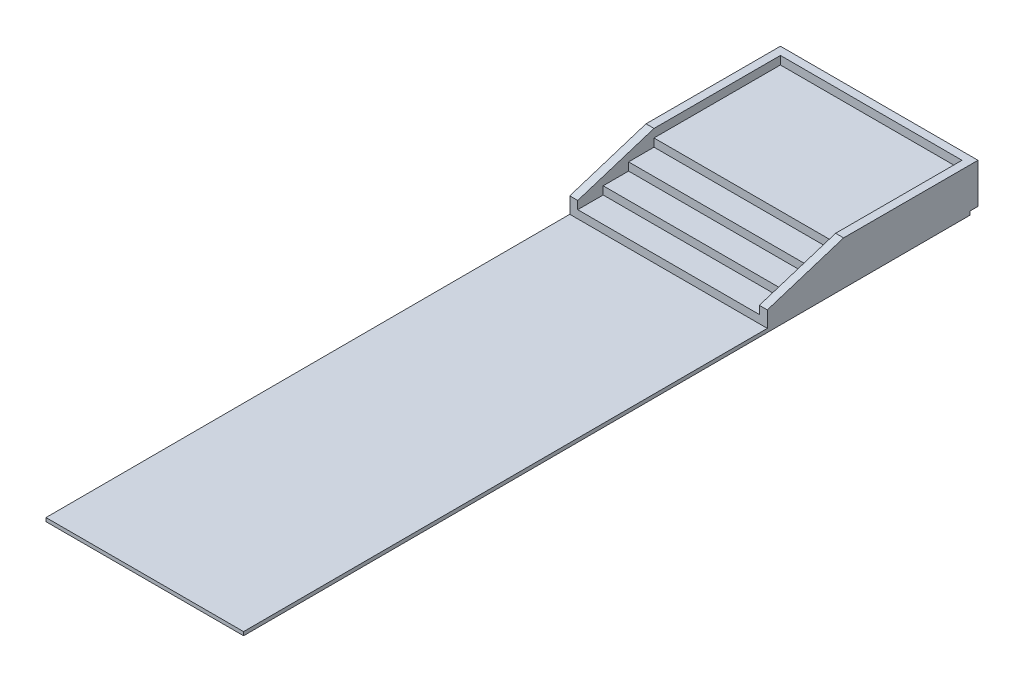
ISO-10303-21;
HEADER;
FILE_DESCRIPTION(('STEP AP214'),'2;1');
FILE_NAME('part.step','',(''),(''),'','','');
FILE_SCHEMA(('AUTOMOTIVE_DESIGN { 1 0 10303 214 1 1 1 1 }'));
ENDSEC;
DATA;
#1=APPLICATION_CONTEXT('core data for automotive mechanical design processes');
#2=APPLICATION_PROTOCOL_DEFINITION('international standard','automotive_design',2000,#1);
#3=PRODUCT_CONTEXT('',#1,'mechanical');
#4=PRODUCT('Part','Part','',(#3));
#5=PRODUCT_RELATED_PRODUCT_CATEGORY('part','',(#4));
#6=PRODUCT_DEFINITION_FORMATION('','',#4);
#7=PRODUCT_DEFINITION_CONTEXT('part definition',#1,'design');
#8=PRODUCT_DEFINITION('design','',#6,#7);
#9=PRODUCT_DEFINITION_SHAPE('','',#8);
#10=(LENGTH_UNIT() NAMED_UNIT(*) SI_UNIT(.MILLI.,.METRE.));
#11=(NAMED_UNIT(*) PLANE_ANGLE_UNIT() SI_UNIT($,.RADIAN.));
#12=(NAMED_UNIT(*) SI_UNIT($,.STERADIAN.) SOLID_ANGLE_UNIT());
#13=UNCERTAINTY_MEASURE_WITH_UNIT(LENGTH_MEASURE(1.E-05),#10,'distance_accuracy_value','');
#14=(GEOMETRIC_REPRESENTATION_CONTEXT(3) GLOBAL_UNCERTAINTY_ASSIGNED_CONTEXT((#13)) GLOBAL_UNIT_ASSIGNED_CONTEXT((#10,
#11,#12)) REPRESENTATION_CONTEXT('',''));
#15=CARTESIAN_POINT('',(0.,0.,0.));
#16=DIRECTION('',(0.,0.,1.));
#17=DIRECTION('',(1.,0.,0.));
#18=AXIS2_PLACEMENT_3D('',#15,#16,#17);
#19=CARTESIAN_POINT('',(500.,0.,0.));
#20=DIRECTION('',(1.,0.,0.));
#21=DIRECTION('',(0.,0.,-1.));
#22=AXIS2_PLACEMENT_3D('',#19,#20,#21);
#23=PLANE('',#22);
#24=DIRECTION('',(0.,-1.,0.));
#25=VECTOR('',#24,1.);
#26=CARTESIAN_POINT('',(500.,110.,-349.256226637812));
#27=LINE('',#26,#25);
#28=CARTESIAN_POINT('',(500.,110.,-349.256226637812));
#29=VERTEX_POINT('',#28);
#30=CARTESIAN_POINT('',(500.,87.2165650206571,-349.256226637812));
#31=VERTEX_POINT('',#30);
#32=EDGE_CURVE('E314',#29,#31,#27,.T.);
#33=ORIENTED_EDGE('',*,*,#32,.T.);
#34=DIRECTION('',(0.,0.,1.));
#35=VECTOR('',#34,1.);
#36=CARTESIAN_POINT('',(500.,87.2165650206571,-1.25622663781233));
#37=LINE('',#36,#35);
#38=CARTESIAN_POINT('',(500.,87.2165650206571,-1.25622663781233));
#39=VERTEX_POINT('',#38);
#40=EDGE_CURVE('E199',#31,#39,#37,.T.);
#41=ORIENTED_EDGE('',*,*,#40,.T.);
#42=DIRECTION('',(0.,-1.,0.));
#43=VECTOR('',#42,1.);
#44=CARTESIAN_POINT('',(500.,87.2165650206571,-1.25622663781233));
#45=LINE('',#44,#43);
#46=CARTESIAN_POINT('',(500.,65.2165650206571,-1.25622663781233));
#47=VERTEX_POINT('',#46);
#48=EDGE_CURVE('E139',#39,#47,#45,.T.);
#49=ORIENTED_EDGE('',*,*,#48,.T.);
#50=DIRECTION('',(0.,0.,1.));
#51=VECTOR('',#50,1.);
#52=CARTESIAN_POINT('',(500.,65.2165650206571,-1.25622663781233));
#53=LINE('',#52,#51);
#54=CARTESIAN_POINT('',(500.,65.2165650206571,68.7437733621877));
#55=VERTEX_POINT('',#54);
#56=EDGE_CURVE('E137',#47,#55,#53,.T.);
#57=ORIENTED_EDGE('',*,*,#56,.T.);
#58=DIRECTION('',(0.,-1.,0.));
#59=VECTOR('',#58,1.);
#60=CARTESIAN_POINT('',(500.,65.2165650206571,68.7437733621877));
#61=LINE('',#60,#59);
#62=CARTESIAN_POINT('',(500.,43.2165650206571,68.7437733621877));
#63=VERTEX_POINT('',#62);
#64=EDGE_CURVE('E118',#55,#63,#61,.T.);
#65=ORIENTED_EDGE('',*,*,#64,.T.);
#66=DIRECTION('',(0.,0.,1.));
#67=VECTOR('',#66,1.);
#68=CARTESIAN_POINT('',(500.,43.2165650206571,68.7437733621877));
#69=LINE('',#68,#67);
#70=CARTESIAN_POINT('',(500.,43.2165650206571,138.743773362188));
#71=VERTEX_POINT('',#70);
#72=EDGE_CURVE('E129',#63,#71,#69,.T.);
#73=ORIENTED_EDGE('',*,*,#72,.T.);
#74=DIRECTION('',(0.,-1.,0.));
#75=VECTOR('',#74,1.);
#76=CARTESIAN_POINT('',(500.,43.2165650206571,138.743773362188));
#77=LINE('',#76,#75);
#78=CARTESIAN_POINT('',(500.,21.2165650206571,138.743773362188));
#79=VERTEX_POINT('',#78);
#80=EDGE_CURVE('E133',#71,#79,#77,.T.);
#81=ORIENTED_EDGE('',*,*,#80,.T.);
#82=DIRECTION('',(0.,0.,1.));
#83=VECTOR('',#82,1.);
#84=CARTESIAN_POINT('',(500.,21.2165650206571,138.743773362188));
#85=LINE('',#84,#83);
#86=CARTESIAN_POINT('',(500.,21.2165650206571,208.743773362188));
#87=VERTEX_POINT('',#86);
#88=EDGE_CURVE('E144',#79,#87,#85,.T.);
#89=ORIENTED_EDGE('',*,*,#88,.T.);
#90=DIRECTION('',(0.,-1.,0.));
#91=VECTOR('',#90,1.);
#92=CARTESIAN_POINT('',(500.,-0.783434979342946,208.743773362188));
#93=LINE('',#92,#91);
#94=CARTESIAN_POINT('',(500.,43.2165650206571,208.743773362188));
#95=VERTEX_POINT('',#94);
#96=EDGE_CURVE('E193',#95,#87,#93,.T.);
#97=ORIENTED_EDGE('',*,*,#96,.F.);
#98=DIRECTION('',(0.,-0.303060470018651,0.952971327749201));
#99=VECTOR('',#98,1.);
#100=CARTESIAN_POINT('',(500.,110.,-1.25622663781244));
#101=LINE('',#100,#99);
#102=CARTESIAN_POINT('',(500.,110.,-1.25622663781244));
#103=VERTEX_POINT('',#102);
#104=EDGE_CURVE('E198',#103,#95,#101,.T.);
#105=ORIENTED_EDGE('',*,*,#104,.F.);
#106=DIRECTION('',(0.,0.,1.));
#107=VECTOR('',#106,1.);
#108=CARTESIAN_POINT('',(500.,110.,-371.256226637812));
#109=LINE('',#108,#107);
#110=EDGE_CURVE('E59',#29,#103,#109,.T.);
#111=ORIENTED_EDGE('',*,*,#110,.F.);
#112=EDGE_LOOP('',(#33,#41,#49,#57,#65,#73,#81,#89,#97,#105,#111));
#113=FACE_BOUND('',#112,.T.);
#114=ADVANCED_FACE('F41',(#113),#23,.F.);
#115=CARTESIAN_POINT('',(0.,0.,0.));
#116=DIRECTION('',(1.,0.,0.));
#117=DIRECTION('',(0.,0.,-1.));
#118=AXIS2_PLACEMENT_3D('',#115,#116,#117);
#119=PLANE('',#118);
#120=DIRECTION('',(0.,0.,1.));
#121=VECTOR('',#120,1.);
#122=CARTESIAN_POINT('',(0.,87.2165650206571,-1.25622663781233));
#123=LINE('',#122,#121);
#124=CARTESIAN_POINT('',(0.,87.2165650206571,-349.256226637812));
#125=VERTEX_POINT('',#124);
#126=CARTESIAN_POINT('',(0.,87.2165650206571,-1.25622663781233));
#127=VERTEX_POINT('',#126);
#128=EDGE_CURVE('E147',#125,#127,#123,.T.);
#129=ORIENTED_EDGE('',*,*,#128,.F.);
#130=DIRECTION('',(0.,-1.,0.));
#131=VECTOR('',#130,1.);
#132=CARTESIAN_POINT('',(0.,110.,-349.256226637812));
#133=LINE('',#132,#131);
#134=CARTESIAN_POINT('',(0.,110.,-349.256226637812));
#135=VERTEX_POINT('',#134);
#136=EDGE_CURVE('E306',#135,#125,#133,.T.);
#137=ORIENTED_EDGE('',*,*,#136,.F.);
#138=DIRECTION('',(0.,0.,1.));
#139=VECTOR('',#138,1.);
#140=CARTESIAN_POINT('',(0.,110.,-371.256226637812));
#141=LINE('',#140,#139);
#142=CARTESIAN_POINT('',(0.,110.,-1.25622663781244));
#143=VERTEX_POINT('',#142);
#144=EDGE_CURVE('E260',#135,#143,#141,.T.);
#145=ORIENTED_EDGE('',*,*,#144,.T.);
#146=DIRECTION('',(0.,-0.303060470018651,0.952971327749201));
#147=VECTOR('',#146,1.);
#148=CARTESIAN_POINT('',(0.,110.,-1.25622663781244));
#149=LINE('',#148,#147);
#150=CARTESIAN_POINT('',(0.,43.2165650206571,208.743773362188));
#151=VERTEX_POINT('',#150);
#152=EDGE_CURVE('E241',#143,#151,#149,.T.);
#153=ORIENTED_EDGE('',*,*,#152,.T.);
#154=DIRECTION('',(0.,-1.,0.));
#155=VECTOR('',#154,1.);
#156=CARTESIAN_POINT('',(0.,-0.783434979342946,208.743773362188));
#157=LINE('',#156,#155);
#158=CARTESIAN_POINT('',(0.,21.2165650206571,208.743773362188));
#159=VERTEX_POINT('',#158);
#160=EDGE_CURVE('E238',#151,#159,#157,.T.);
#161=ORIENTED_EDGE('',*,*,#160,.T.);
#162=DIRECTION('',(0.,0.,1.));
#163=VECTOR('',#162,1.);
#164=CARTESIAN_POINT('',(0.,21.2165650206571,138.743773362188));
#165=LINE('',#164,#163);
#166=CARTESIAN_POINT('',(0.,21.2165650206571,138.743773362188));
#167=VERTEX_POINT('',#166);
#168=EDGE_CURVE('E45',#167,#159,#165,.T.);
#169=ORIENTED_EDGE('',*,*,#168,.F.);
#170=DIRECTION('',(0.,-1.,0.));
#171=VECTOR('',#170,1.);
#172=CARTESIAN_POINT('',(0.,43.2165650206571,138.743773362188));
#173=LINE('',#172,#171);
#174=CARTESIAN_POINT('',(0.,43.2165650206571,138.743773362188));
#175=VERTEX_POINT('',#174);
#176=EDGE_CURVE('E168',#175,#167,#173,.T.);
#177=ORIENTED_EDGE('',*,*,#176,.F.);
#178=DIRECTION('',(0.,0.,1.));
#179=VECTOR('',#178,1.);
#180=CARTESIAN_POINT('',(0.,43.2165650206571,68.7437733621877));
#181=LINE('',#180,#179);
#182=CARTESIAN_POINT('',(0.,43.2165650206571,68.7437733621877));
#183=VERTEX_POINT('',#182);
#184=EDGE_CURVE('E170',#183,#175,#181,.T.);
#185=ORIENTED_EDGE('',*,*,#184,.F.);
#186=DIRECTION('',(0.,-1.,0.));
#187=VECTOR('',#186,1.);
#188=CARTESIAN_POINT('',(0.,65.2165650206571,68.7437733621877));
#189=LINE('',#188,#187);
#190=CARTESIAN_POINT('',(0.,65.2165650206571,68.7437733621877));
#191=VERTEX_POINT('',#190);
#192=EDGE_CURVE('E122',#191,#183,#189,.T.);
#193=ORIENTED_EDGE('',*,*,#192,.F.);
#194=DIRECTION('',(0.,0.,1.));
#195=VECTOR('',#194,1.);
#196=CARTESIAN_POINT('',(0.,65.2165650206571,-1.25622663781233));
#197=LINE('',#196,#195);
#198=CARTESIAN_POINT('',(0.,65.2165650206571,-1.25622663781233));
#199=VERTEX_POINT('',#198);
#200=EDGE_CURVE('E173',#199,#191,#197,.T.);
#201=ORIENTED_EDGE('',*,*,#200,.F.);
#202=DIRECTION('',(0.,-1.,0.));
#203=VECTOR('',#202,1.);
#204=CARTESIAN_POINT('',(0.,87.2165650206571,-1.25622663781233));
#205=LINE('',#204,#203);
#206=EDGE_CURVE('E82',#127,#199,#205,.T.);
#207=ORIENTED_EDGE('',*,*,#206,.F.);
#208=EDGE_LOOP('',(#129,#137,#145,#153,#161,#169,#177,#185,#193,#201,#207));
#209=FACE_BOUND('',#208,.T.);
#210=ADVANCED_FACE('F324',(#209),#119,.T.);
#211=CARTESIAN_POINT('',(500.,87.2165650206571,-1.25622663781233));
#212=DIRECTION('',(0.,-1.,0.));
#213=DIRECTION('',(0.,0.,-1.));
#214=AXIS2_PLACEMENT_3D('',#211,#212,#213);
#215=PLANE('',#214);
#216=ORIENTED_EDGE('',*,*,#128,.T.);
#217=DIRECTION('',(-1.,0.,0.));
#218=VECTOR('',#217,1.);
#219=CARTESIAN_POINT('',(500.,87.2165650206571,-1.25622663781233));
#220=LINE('',#219,#218);
#221=EDGE_CURVE('E51',#39,#127,#220,.T.);
#222=ORIENTED_EDGE('',*,*,#221,.F.);
#223=ORIENTED_EDGE('',*,*,#40,.F.);
#224=DIRECTION('',(-1.,0.,0.));
#225=VECTOR('',#224,1.);
#226=CARTESIAN_POINT('',(500.,87.2165650206571,-349.256226637812));
#227=LINE('',#226,#225);
#228=EDGE_CURVE('E11',#31,#125,#227,.T.);
#229=ORIENTED_EDGE('',*,*,#228,.T.);
#230=EDGE_LOOP('',(#216,#222,#223,#229));
#231=FACE_BOUND('',#230,.T.);
#232=ADVANCED_FACE('F43',(#231),#215,.F.);
#233=CARTESIAN_POINT('',(500.,87.2165650206571,-1.25622663781233));
#234=DIRECTION('',(0.,0.,-1.));
#235=DIRECTION('',(0.,1.,0.));
#236=AXIS2_PLACEMENT_3D('',#233,#234,#235);
#237=PLANE('',#236);
#238=ORIENTED_EDGE('',*,*,#206,.T.);
#239=DIRECTION('',(-1.,0.,0.));
#240=VECTOR('',#239,1.);
#241=CARTESIAN_POINT('',(500.,65.2165650206571,-1.25622663781233));
#242=LINE('',#241,#240);
#243=EDGE_CURVE('E157',#47,#199,#242,.T.);
#244=ORIENTED_EDGE('',*,*,#243,.F.);
#245=ORIENTED_EDGE('',*,*,#48,.F.);
#246=ORIENTED_EDGE('',*,*,#221,.T.);
#247=EDGE_LOOP('',(#238,#244,#245,#246));
#248=FACE_BOUND('',#247,.T.);
#249=ADVANCED_FACE('F477',(#248),#237,.F.);
#250=CARTESIAN_POINT('',(500.,65.2165650206571,-1.25622663781233));
#251=DIRECTION('',(0.,-1.,0.));
#252=DIRECTION('',(0.,0.,-1.));
#253=AXIS2_PLACEMENT_3D('',#250,#251,#252);
#254=PLANE('',#253);
#255=ORIENTED_EDGE('',*,*,#200,.T.);
#256=DIRECTION('',(-1.,0.,0.));
#257=VECTOR('',#256,1.);
#258=CARTESIAN_POINT('',(500.,65.2165650206571,68.7437733621877));
#259=LINE('',#258,#257);
#260=EDGE_CURVE('E125',#55,#191,#259,.T.);
#261=ORIENTED_EDGE('',*,*,#260,.F.);
#262=ORIENTED_EDGE('',*,*,#56,.F.);
#263=ORIENTED_EDGE('',*,*,#243,.T.);
#264=EDGE_LOOP('',(#255,#261,#262,#263));
#265=FACE_BOUND('',#264,.T.);
#266=ADVANCED_FACE('F482',(#265),#254,.F.);
#267=CARTESIAN_POINT('',(500.,65.2165650206571,68.7437733621877));
#268=DIRECTION('',(0.,0.,-1.));
#269=DIRECTION('',(-1.,0.,0.));
#270=AXIS2_PLACEMENT_3D('',#267,#268,#269);
#271=PLANE('',#270);
#272=ORIENTED_EDGE('',*,*,#192,.T.);
#273=DIRECTION('',(-1.,0.,0.));
#274=VECTOR('',#273,1.);
#275=CARTESIAN_POINT('',(500.,43.2165650206571,68.7437733621877));
#276=LINE('',#275,#274);
#277=EDGE_CURVE('E113',#63,#183,#276,.T.);
#278=ORIENTED_EDGE('',*,*,#277,.F.);
#279=ORIENTED_EDGE('',*,*,#64,.F.);
#280=ORIENTED_EDGE('',*,*,#260,.T.);
#281=EDGE_LOOP('',(#272,#278,#279,#280));
#282=FACE_BOUND('',#281,.T.);
#283=ADVANCED_FACE('F115',(#282),#271,.F.);
#284=CARTESIAN_POINT('',(500.,43.2165650206571,68.7437733621877));
#285=DIRECTION('',(0.,-1.,0.));
#286=DIRECTION('',(0.,0.,-1.));
#287=AXIS2_PLACEMENT_3D('',#284,#285,#286);
#288=PLANE('',#287);
#289=ORIENTED_EDGE('',*,*,#184,.T.);
#290=DIRECTION('',(-1.,0.,0.));
#291=VECTOR('',#290,1.);
#292=CARTESIAN_POINT('',(500.,43.2165650206571,138.743773362188));
#293=LINE('',#292,#291);
#294=EDGE_CURVE('E126',#71,#175,#293,.T.);
#295=ORIENTED_EDGE('',*,*,#294,.F.);
#296=ORIENTED_EDGE('',*,*,#72,.F.);
#297=ORIENTED_EDGE('',*,*,#277,.T.);
#298=EDGE_LOOP('',(#289,#295,#296,#297));
#299=FACE_BOUND('',#298,.T.);
#300=ADVANCED_FACE('F130',(#299),#288,.F.);
#301=CARTESIAN_POINT('',(500.,43.2165650206571,138.743773362188));
#302=DIRECTION('',(0.,0.,-1.));
#303=DIRECTION('',(-1.,0.,0.));
#304=AXIS2_PLACEMENT_3D('',#301,#302,#303);
#305=PLANE('',#304);
#306=ORIENTED_EDGE('',*,*,#176,.T.);
#307=DIRECTION('',(-1.,0.,0.));
#308=VECTOR('',#307,1.);
#309=CARTESIAN_POINT('',(500.,21.2165650206571,138.743773362188));
#310=LINE('',#309,#308);
#311=EDGE_CURVE('E68',#79,#167,#310,.T.);
#312=ORIENTED_EDGE('',*,*,#311,.F.);
#313=ORIENTED_EDGE('',*,*,#80,.F.);
#314=ORIENTED_EDGE('',*,*,#294,.T.);
#315=EDGE_LOOP('',(#306,#312,#313,#314));
#316=FACE_BOUND('',#315,.T.);
#317=ADVANCED_FACE('F509',(#316),#305,.F.);
#318=CARTESIAN_POINT('',(500.,21.2165650206571,138.743773362188));
#319=DIRECTION('',(0.,-1.,0.));
#320=DIRECTION('',(0.,0.,-1.));
#321=AXIS2_PLACEMENT_3D('',#318,#319,#320);
#322=PLANE('',#321);
#323=ORIENTED_EDGE('',*,*,#168,.T.);
#324=DIRECTION('',(-1.,0.,0.));
#325=VECTOR('',#324,1.);
#326=CARTESIAN_POINT('',(500.,21.2165650206571,208.743773362188));
#327=LINE('',#326,#325);
#328=EDGE_CURVE('E92',#87,#159,#327,.T.);
#329=ORIENTED_EDGE('',*,*,#328,.F.);
#330=ORIENTED_EDGE('',*,*,#88,.F.);
#331=ORIENTED_EDGE('',*,*,#311,.T.);
#332=EDGE_LOOP('',(#323,#329,#330,#331));
#333=FACE_BOUND('',#332,.T.);
#334=ADVANCED_FACE('F517',(#333),#322,.F.);
#335=CARTESIAN_POINT('',(500.,21.2165650206571,208.743773362188));
#336=DIRECTION('',(0.,0.,-1.));
#337=DIRECTION('',(-1.,0.,0.));
#338=AXIS2_PLACEMENT_3D('',#335,#336,#337);
#339=PLANE('',#338);
#340=ORIENTED_EDGE('',*,*,#328,.T.);
#341=ORIENTED_EDGE('',*,*,#160,.F.);
#342=DIRECTION('',(-1.,0.,0.));
#343=VECTOR('',#342,1.);
#344=CARTESIAN_POINT('',(0.,43.2165650206571,208.743773362188));
#345=LINE('',#344,#343);
#346=CARTESIAN_POINT('',(-22.,43.2165650206571,208.743773362188));
#347=VERTEX_POINT('',#346);
#348=EDGE_CURVE('E224',#151,#347,#345,.T.);
#349=ORIENTED_EDGE('',*,*,#348,.T.);
#350=DIRECTION('',(0.,-1.,0.));
#351=VECTOR('',#350,1.);
#352=CARTESIAN_POINT('',(-22.,-0.783434979342946,208.743773362188));
#353=LINE('',#352,#351);
#354=CARTESIAN_POINT('',(-22.,-0.783434979342946,208.743773362188));
#355=VERTEX_POINT('',#354);
#356=EDGE_CURVE('E258',#347,#355,#353,.T.);
#357=ORIENTED_EDGE('',*,*,#356,.T.);
#358=DIRECTION('',(-1.,0.,0.));
#359=VECTOR('',#358,1.);
#360=CARTESIAN_POINT('',(500.,-0.783434979342946,208.743773362188));
#361=LINE('',#360,#359);
#362=CARTESIAN_POINT('',(522.,-0.783434979342946,208.743773362188));
#363=VERTEX_POINT('',#362);
#364=EDGE_CURVE('E153',#363,#355,#361,.T.);
#365=ORIENTED_EDGE('',*,*,#364,.F.);
#366=DIRECTION('',(0.,-1.,0.));
#367=VECTOR('',#366,1.);
#368=CARTESIAN_POINT('',(522.,-0.783434979342946,208.743773362188));
#369=LINE('',#368,#367);
#370=CARTESIAN_POINT('',(522.,43.2165650206571,208.743773362188));
#371=VERTEX_POINT('',#370);
#372=EDGE_CURVE('E206',#371,#363,#369,.T.);
#373=ORIENTED_EDGE('',*,*,#372,.F.);
#374=DIRECTION('',(-1.,0.,0.));
#375=VECTOR('',#374,1.);
#376=CARTESIAN_POINT('',(522.,43.2165650206571,208.743773362188));
#377=LINE('',#376,#375);
#378=EDGE_CURVE('E204',#371,#95,#377,.T.);
#379=ORIENTED_EDGE('',*,*,#378,.T.);
#380=ORIENTED_EDGE('',*,*,#96,.T.);
#381=EDGE_LOOP('',(#340,#341,#349,#357,#365,#373,#379,#380));
#382=FACE_BOUND('',#381,.T.);
#383=ADVANCED_FACE('F267',(#382),#339,.F.);
#384=CARTESIAN_POINT('',(522.,0.,-349.256226637812));
#385=DIRECTION('',(0.,1.,0.));
#386=DIRECTION('',(0.,0.,1.));
#387=AXIS2_PLACEMENT_3D('',#384,#385,#386);
#388=PLANE('',#387);
#389=DIRECTION('',(0.,0.,-1.));
#390=VECTOR('',#389,1.);
#391=CARTESIAN_POINT('',(522.,0.,-349.256226637812));
#392=LINE('',#391,#390);
#393=CARTESIAN_POINT('',(522.,0.,-349.256226637812));
#394=VERTEX_POINT('',#393);
#395=CARTESIAN_POINT('',(522.,0.,-371.256226637812));
#396=VERTEX_POINT('',#395);
#397=EDGE_CURVE('E197',#394,#396,#392,.T.);
#398=ORIENTED_EDGE('',*,*,#397,.F.);
#399=DIRECTION('',(-1.,0.,0.));
#400=VECTOR('',#399,1.);
#401=CARTESIAN_POINT('',(500.,0.,-349.256226637812));
#402=LINE('',#401,#400);
#403=CARTESIAN_POINT('',(-22.,0.,-349.256226637812));
#404=VERTEX_POINT('',#403);
#405=EDGE_CURVE('E150',#394,#404,#402,.T.);
#406=ORIENTED_EDGE('',*,*,#405,.T.);
#407=DIRECTION('',(0.,0.,-1.));
#408=VECTOR('',#407,1.);
#409=CARTESIAN_POINT('',(-22.,0.,-349.256226637812));
#410=LINE('',#409,#408);
#411=CARTESIAN_POINT('',(-22.,0.,-371.256226637812));
#412=VERTEX_POINT('',#411);
#413=EDGE_CURVE('E247',#404,#412,#410,.T.);
#414=ORIENTED_EDGE('',*,*,#413,.T.);
#415=DIRECTION('',(-1.,0.,0.));
#416=VECTOR('',#415,1.);
#417=CARTESIAN_POINT('',(522.,0.,-371.256226637812));
#418=LINE('',#417,#416);
#419=EDGE_CURVE('E177',#396,#412,#418,.T.);
#420=ORIENTED_EDGE('',*,*,#419,.F.);
#421=EDGE_LOOP('',(#398,#406,#414,#420));
#422=FACE_BOUND('',#421,.T.);
#423=ADVANCED_FACE('F398',(#422),#388,.F.);
#424=CARTESIAN_POINT('',(522.,0.,-371.256226637812));
#425=DIRECTION('',(0.,0.,1.));
#426=DIRECTION('',(1.,0.,0.));
#427=AXIS2_PLACEMENT_3D('',#424,#425,#426);
#428=PLANE('',#427);
#429=ORIENTED_EDGE('',*,*,#419,.T.);
#430=DIRECTION('',(0.,1.,0.));
#431=VECTOR('',#430,1.);
#432=CARTESIAN_POINT('',(-22.,0.,-371.256226637812));
#433=LINE('',#432,#431);
#434=CARTESIAN_POINT('',(-22.,110.,-371.256226637812));
#435=VERTEX_POINT('',#434);
#436=EDGE_CURVE('E249',#412,#435,#433,.T.);
#437=ORIENTED_EDGE('',*,*,#436,.T.);
#438=DIRECTION('',(-1.,0.,0.));
#439=VECTOR('',#438,1.);
#440=CARTESIAN_POINT('',(522.,110.,-371.256226637812));
#441=LINE('',#440,#439);
#442=CARTESIAN_POINT('',(522.,110.,-371.256226637812));
#443=VERTEX_POINT('',#442);
#444=EDGE_CURVE('E180',#443,#435,#441,.T.);
#445=ORIENTED_EDGE('',*,*,#444,.F.);
#446=DIRECTION('',(0.,1.,0.));
#447=VECTOR('',#446,1.);
#448=CARTESIAN_POINT('',(522.,0.,-371.256226637812));
#449=LINE('',#448,#447);
#450=EDGE_CURVE('E233',#396,#443,#449,.T.);
#451=ORIENTED_EDGE('',*,*,#450,.F.);
#452=EDGE_LOOP('',(#429,#437,#445,#451));
#453=FACE_BOUND('',#452,.T.);
#454=ADVANCED_FACE('F400',(#453),#428,.F.);
#455=CARTESIAN_POINT('',(522.,110.,-371.256226637812));
#456=DIRECTION('',(0.,-1.,0.));
#457=DIRECTION('',(0.,0.,-1.));
#458=AXIS2_PLACEMENT_3D('',#455,#456,#457);
#459=PLANE('',#458);
#460=ORIENTED_EDGE('',*,*,#444,.T.);
#461=DIRECTION('',(0.,0.,1.));
#462=VECTOR('',#461,1.);
#463=CARTESIAN_POINT('',(-22.,110.,-371.256226637812));
#464=LINE('',#463,#462);
#465=CARTESIAN_POINT('',(-22.,110.,-1.25622663781244));
#466=VERTEX_POINT('',#465);
#467=EDGE_CURVE('E252',#435,#466,#464,.T.);
#468=ORIENTED_EDGE('',*,*,#467,.T.);
#469=DIRECTION('',(-1.,0.,0.));
#470=VECTOR('',#469,1.);
#471=CARTESIAN_POINT('',(0.,110.,-1.25622663781244));
#472=LINE('',#471,#470);
#473=EDGE_CURVE('E222',#143,#466,#472,.T.);
#474=ORIENTED_EDGE('',*,*,#473,.F.);
#475=ORIENTED_EDGE('',*,*,#144,.F.);
#476=DIRECTION('',(-1.,0.,0.));
#477=VECTOR('',#476,1.);
#478=CARTESIAN_POINT('',(500.,110.,-349.256226637812));
#479=LINE('',#478,#477);
#480=EDGE_CURVE('E250',#29,#135,#479,.T.);
#481=ORIENTED_EDGE('',*,*,#480,.F.);
#482=ORIENTED_EDGE('',*,*,#110,.T.);
#483=DIRECTION('',(-1.,0.,0.));
#484=VECTOR('',#483,1.);
#485=CARTESIAN_POINT('',(522.,110.,-1.25622663781244));
#486=LINE('',#485,#484);
#487=CARTESIAN_POINT('',(522.,110.,-1.25622663781244));
#488=VERTEX_POINT('',#487);
#489=EDGE_CURVE('E189',#488,#103,#486,.T.);
#490=ORIENTED_EDGE('',*,*,#489,.F.);
#491=DIRECTION('',(0.,0.,1.));
#492=VECTOR('',#491,1.);
#493=CARTESIAN_POINT('',(522.,110.,-371.256226637812));
#494=LINE('',#493,#492);
#495=EDGE_CURVE('E230',#443,#488,#494,.T.);
#496=ORIENTED_EDGE('',*,*,#495,.F.);
#497=EDGE_LOOP('',(#460,#468,#474,#475,#481,#482,#490,#496));
#498=FACE_BOUND('',#497,.T.);
#499=ADVANCED_FACE('F401',(#498),#459,.F.);
#500=CARTESIAN_POINT('',(522.,110.,-1.25622663781244));
#501=DIRECTION('',(0.,-0.952971327749201,-0.303060470018651));
#502=DIRECTION('',(0.,0.303060470018651,-0.952971327749201));
#503=AXIS2_PLACEMENT_3D('',#500,#501,#502);
#504=PLANE('',#503);
#505=ORIENTED_EDGE('',*,*,#104,.T.);
#506=ORIENTED_EDGE('',*,*,#378,.F.);
#507=DIRECTION('',(0.,-0.303060470018651,0.952971327749201));
#508=VECTOR('',#507,1.);
#509=CARTESIAN_POINT('',(522.,110.,-1.25622663781244));
#510=LINE('',#509,#508);
#511=EDGE_CURVE('E217',#488,#371,#510,.T.);
#512=ORIENTED_EDGE('',*,*,#511,.F.);
#513=ORIENTED_EDGE('',*,*,#489,.T.);
#514=EDGE_LOOP('',(#505,#506,#512,#513));
#515=FACE_BOUND('',#514,.T.);
#516=ADVANCED_FACE('F213',(#515),#504,.F.);
#517=CARTESIAN_POINT('',(522.,0.,0.));
#518=DIRECTION('',(1.,0.,0.));
#519=DIRECTION('',(0.,0.,-1.));
#520=AXIS2_PLACEMENT_3D('',#517,#518,#519);
#521=PLANE('',#520);
#522=ORIENTED_EDGE('',*,*,#372,.T.);
#523=DIRECTION('',(0.,-0.00140400395551691,0.999999014385961));
#524=VECTOR('',#523,1.);
#525=CARTESIAN_POINT('',(522.,0.,-349.256226637812));
#526=LINE('',#525,#524);
#527=CARTESIAN_POINT('',(522.,-2.80800791103382,1650.74180213411));
#528=VERTEX_POINT('',#527);
#529=EDGE_CURVE('E294',#363,#528,#526,.T.);
#530=ORIENTED_EDGE('',*,*,#529,.T.);
#531=DIRECTION('',(0.,0.999999014385961,0.00140400395551691));
#532=VECTOR('',#531,1.);
#533=CARTESIAN_POINT('',(522.,-12.8079980548934,1650.72776209455));
#534=LINE('',#533,#532);
#535=CARTESIAN_POINT('',(522.,-12.8079980548934,1650.72776209455));
#536=VERTEX_POINT('',#535);
#537=EDGE_CURVE('E307',#536,#528,#534,.T.);
#538=ORIENTED_EDGE('',*,*,#537,.F.);
#539=DIRECTION('',(0.,-0.00140400395551691,0.999999014385961));
#540=VECTOR('',#539,1.);
#541=CARTESIAN_POINT('',(522.,-9.9999901438596,-349.270266677368));
#542=LINE('',#541,#540);
#543=CARTESIAN_POINT('',(522.,-9.9999901438596,-349.270266677368));
#544=VERTEX_POINT('',#543);
#545=EDGE_CURVE('E297',#544,#536,#542,.T.);
#546=ORIENTED_EDGE('',*,*,#545,.F.);
#547=DIRECTION('',(0.,0.999999014385961,0.00140400395551691));
#548=VECTOR('',#547,1.);
#549=CARTESIAN_POINT('',(522.,-9.9999901438596,-349.270266677368));
#550=LINE('',#549,#548);
#551=EDGE_CURVE('E303',#544,#394,#550,.T.);
#552=ORIENTED_EDGE('',*,*,#551,.T.);
#553=ORIENTED_EDGE('',*,*,#397,.T.);
#554=ORIENTED_EDGE('',*,*,#450,.T.);
#555=ORIENTED_EDGE('',*,*,#495,.T.);
#556=ORIENTED_EDGE('',*,*,#511,.T.);
#557=EDGE_LOOP('',(#522,#530,#538,#546,#552,#553,#554,#555,#556));
#558=FACE_BOUND('',#557,.T.);
#559=ADVANCED_FACE('F359',(#558),#521,.T.);
#560=CARTESIAN_POINT('',(0.,110.,-1.25622663781244));
#561=DIRECTION('',(0.,-0.952971327749201,-0.303060470018651));
#562=DIRECTION('',(0.,0.303060470018651,-0.952971327749201));
#563=AXIS2_PLACEMENT_3D('',#560,#561,#562);
#564=PLANE('',#563);
#565=DIRECTION('',(0.,-0.303060470018651,0.952971327749201));
#566=VECTOR('',#565,1.);
#567=CARTESIAN_POINT('',(-22.,110.,-1.25622663781244));
#568=LINE('',#567,#566);
#569=EDGE_CURVE('E255',#466,#347,#568,.T.);
#570=ORIENTED_EDGE('',*,*,#569,.T.);
#571=ORIENTED_EDGE('',*,*,#348,.F.);
#572=ORIENTED_EDGE('',*,*,#152,.F.);
#573=ORIENTED_EDGE('',*,*,#473,.T.);
#574=EDGE_LOOP('',(#570,#571,#572,#573));
#575=FACE_BOUND('',#574,.T.);
#576=ADVANCED_FACE('F328',(#575),#564,.F.);
#577=CARTESIAN_POINT('',(-22.,0.,0.));
#578=DIRECTION('',(1.,0.,0.));
#579=DIRECTION('',(0.,0.,-1.));
#580=AXIS2_PLACEMENT_3D('',#577,#578,#579);
#581=PLANE('',#580);
#582=ORIENTED_EDGE('',*,*,#413,.F.);
#583=DIRECTION('',(0.,0.999999014385961,0.00140400395551691));
#584=VECTOR('',#583,1.);
#585=CARTESIAN_POINT('',(-22.,-9.9999901438596,-349.270266677368));
#586=LINE('',#585,#584);
#587=CARTESIAN_POINT('',(-22.,-9.9999901438596,-349.270266677368));
#588=VERTEX_POINT('',#587);
#589=EDGE_CURVE('E311',#588,#404,#586,.T.);
#590=ORIENTED_EDGE('',*,*,#589,.F.);
#591=DIRECTION('',(0.,-0.00140400395551691,0.999999014385961));
#592=VECTOR('',#591,1.);
#593=CARTESIAN_POINT('',(-22.,-9.9999901438596,-349.270266677368));
#594=LINE('',#593,#592);
#595=CARTESIAN_POINT('',(-22.,-12.8079980548934,1650.72776209455));
#596=VERTEX_POINT('',#595);
#597=EDGE_CURVE('E379',#588,#596,#594,.T.);
#598=ORIENTED_EDGE('',*,*,#597,.T.);
#599=DIRECTION('',(0.,0.999999014385961,0.00140400395551691));
#600=VECTOR('',#599,1.);
#601=CARTESIAN_POINT('',(-22.,-12.8079980548934,1650.72776209455));
#602=LINE('',#601,#600);
#603=CARTESIAN_POINT('',(-22.,-2.80800791103382,1650.74180213411));
#604=VERTEX_POINT('',#603);
#605=EDGE_CURVE('E286',#596,#604,#602,.T.);
#606=ORIENTED_EDGE('',*,*,#605,.T.);
#607=DIRECTION('',(0.,-0.00140400395551691,0.999999014385961));
#608=VECTOR('',#607,1.);
#609=CARTESIAN_POINT('',(-22.,0.,-349.256226637812));
#610=LINE('',#609,#608);
#611=EDGE_CURVE('E282',#355,#604,#610,.T.);
#612=ORIENTED_EDGE('',*,*,#611,.F.);
#613=ORIENTED_EDGE('',*,*,#356,.F.);
#614=ORIENTED_EDGE('',*,*,#569,.F.);
#615=ORIENTED_EDGE('',*,*,#467,.F.);
#616=ORIENTED_EDGE('',*,*,#436,.F.);
#617=EDGE_LOOP('',(#582,#590,#598,#606,#612,#613,#614,#615,#616));
#618=FACE_BOUND('',#617,.T.);
#619=ADVANCED_FACE('F278',(#618),#581,.F.);
#620=CARTESIAN_POINT('',(500.,110.,-349.256226637812));
#621=DIRECTION('',(0.,0.,-1.));
#622=DIRECTION('',(-1.,0.,0.));
#623=AXIS2_PLACEMENT_3D('',#620,#621,#622);
#624=PLANE('',#623);
#625=ORIENTED_EDGE('',*,*,#136,.T.);
#626=ORIENTED_EDGE('',*,*,#228,.F.);
#627=ORIENTED_EDGE('',*,*,#32,.F.);
#628=ORIENTED_EDGE('',*,*,#480,.T.);
#629=EDGE_LOOP('',(#625,#626,#627,#628));
#630=FACE_BOUND('',#629,.T.);
#631=ADVANCED_FACE('F422',(#630),#624,.F.);
#632=CARTESIAN_POINT('',(0.,-0.49035664038553,-0.000688463341274402));
#633=DIRECTION('',(0.,0.999999014385961,0.00140400395551691));
#634=DIRECTION('',(0.,-0.00140400395551691,0.999999014385961));
#635=AXIS2_PLACEMENT_3D('',#632,#633,#634);
#636=PLANE('',#635);
#637=ORIENTED_EDGE('',*,*,#364,.T.);
#638=ORIENTED_EDGE('',*,*,#611,.T.);
#639=DIRECTION('',(-1.,0.,0.));
#640=VECTOR('',#639,1.);
#641=CARTESIAN_POINT('',(522.,-2.80800791103382,1650.74180213411));
#642=LINE('',#641,#640);
#643=EDGE_CURVE('E292',#528,#604,#642,.T.);
#644=ORIENTED_EDGE('',*,*,#643,.F.);
#645=ORIENTED_EDGE('',*,*,#529,.F.);
#646=EDGE_LOOP('',(#637,#638,#644,#645));
#647=FACE_BOUND('',#646,.T.);
#648=ADVANCED_FACE('F362',(#647),#636,.T.);
#649=CARTESIAN_POINT('',(522.,-9.9999901438596,-349.270266677368));
#650=DIRECTION('',(0.,0.00140400395551691,-0.999999014385961));
#651=DIRECTION('',(0.,0.999999014385961,0.00140400395551691));
#652=AXIS2_PLACEMENT_3D('',#649,#650,#651);
#653=PLANE('',#652);
#654=ORIENTED_EDGE('',*,*,#405,.F.);
#655=ORIENTED_EDGE('',*,*,#551,.F.);
#656=DIRECTION('',(-1.,0.,0.));
#657=VECTOR('',#656,1.);
#658=CARTESIAN_POINT('',(522.,-9.9999901438596,-349.270266677368));
#659=LINE('',#658,#657);
#660=EDGE_CURVE('E302',#544,#588,#659,.T.);
#661=ORIENTED_EDGE('',*,*,#660,.T.);
#662=ORIENTED_EDGE('',*,*,#589,.T.);
#663=EDGE_LOOP('',(#654,#655,#661,#662));
#664=FACE_BOUND('',#663,.T.);
#665=ADVANCED_FACE('F387',(#664),#653,.T.);
#666=CARTESIAN_POINT('',(522.,-12.8079980548934,1650.72776209455));
#667=DIRECTION('',(0.,0.00140400395551691,-0.999999014385961));
#668=DIRECTION('',(0.,0.999999014385961,0.00140400395551691));
#669=AXIS2_PLACEMENT_3D('',#666,#667,#668);
#670=PLANE('',#669);
#671=ORIENTED_EDGE('',*,*,#643,.T.);
#672=ORIENTED_EDGE('',*,*,#605,.F.);
#673=DIRECTION('',(-1.,0.,0.));
#674=VECTOR('',#673,1.);
#675=CARTESIAN_POINT('',(522.,-12.8079980548934,1650.72776209455));
#676=LINE('',#675,#674);
#677=EDGE_CURVE('E372',#536,#596,#676,.T.);
#678=ORIENTED_EDGE('',*,*,#677,.F.);
#679=ORIENTED_EDGE('',*,*,#537,.T.);
#680=EDGE_LOOP('',(#671,#672,#678,#679));
#681=FACE_BOUND('',#680,.T.);
#682=ADVANCED_FACE('F370',(#681),#670,.F.);
#683=CARTESIAN_POINT('',(0.,-10.4903467842451,-0.0147285028964435));
#684=DIRECTION('',(0.,0.999999014385961,0.00140400395551691));
#685=DIRECTION('',(0.,-0.00140400395551691,0.999999014385961));
#686=AXIS2_PLACEMENT_3D('',#683,#684,#685);
#687=PLANE('',#686);
#688=ORIENTED_EDGE('',*,*,#660,.F.);
#689=ORIENTED_EDGE('',*,*,#545,.T.);
#690=ORIENTED_EDGE('',*,*,#677,.T.);
#691=ORIENTED_EDGE('',*,*,#597,.F.);
#692=EDGE_LOOP('',(#688,#689,#690,#691));
#693=FACE_BOUND('',#692,.T.);
#694=ADVANCED_FACE('F391',(#693),#687,.F.);
#695=CLOSED_SHELL('',(#114,#210,#232,#249,#266,#283,#300,#317,#334,#383,#423,#454,#499,#516,
#559,#576,#619,#631,#648,#665,#682,#694));
#696=MANIFOLD_SOLID_BREP('B2',#695);
#697=ADVANCED_BREP_SHAPE_REPRESENTATION('',(#18,#696),#14);
#698=SHAPE_DEFINITION_REPRESENTATION(#9,#697);
ENDSEC;
END-ISO-10303-21;
